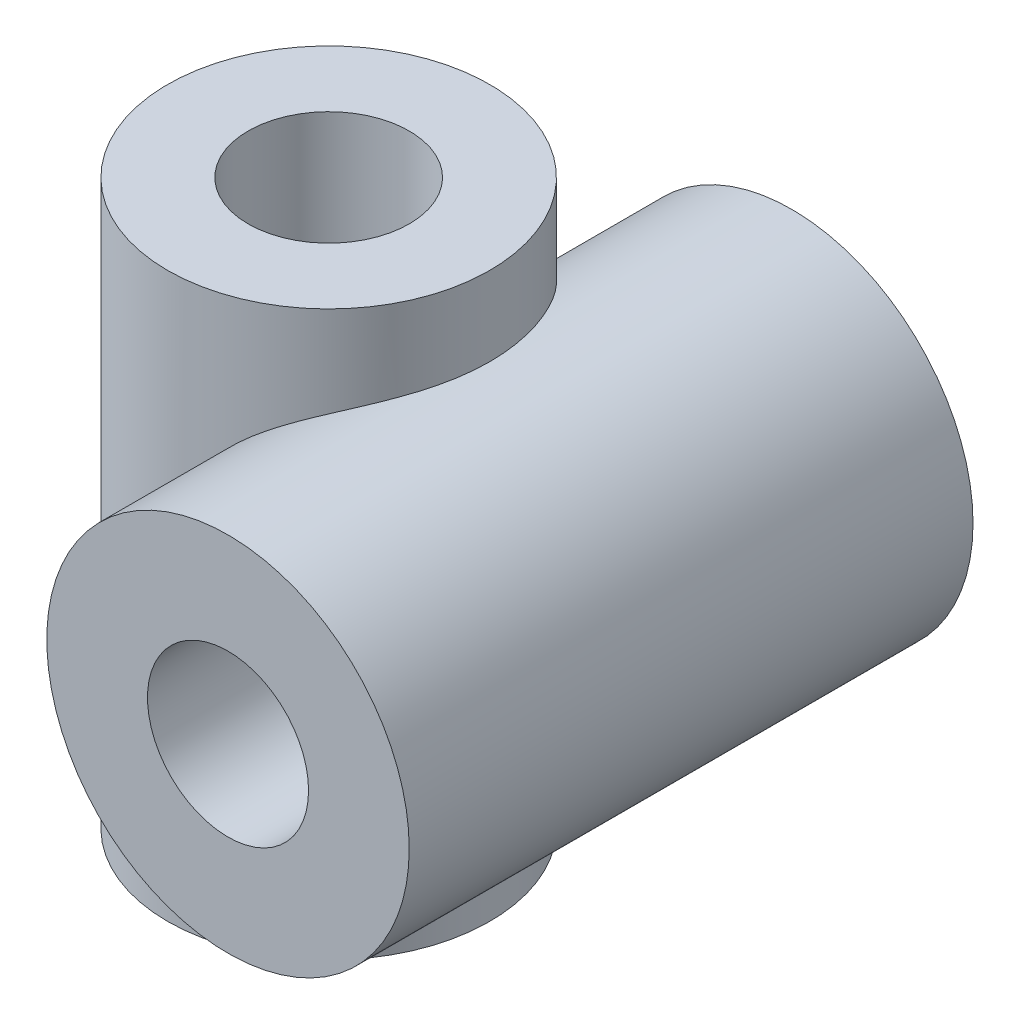
ISO-10303-21;
HEADER;
FILE_DESCRIPTION(('STEP AP214'),'2;1');
FILE_NAME('part.step','',(''),(''),'','','');
FILE_SCHEMA(('AUTOMOTIVE_DESIGN { 1 0 10303 214 1 1 1 1 }'));
ENDSEC;
DATA;
#1=APPLICATION_CONTEXT('core data for automotive mechanical design processes');
#2=APPLICATION_PROTOCOL_DEFINITION('international standard','automotive_design',2000,#1);
#3=PRODUCT_CONTEXT('',#1,'mechanical');
#4=PRODUCT('Part','Part','',(#3));
#5=PRODUCT_RELATED_PRODUCT_CATEGORY('part','',(#4));
#6=PRODUCT_DEFINITION_FORMATION('','',#4);
#7=PRODUCT_DEFINITION_CONTEXT('part definition',#1,'design');
#8=PRODUCT_DEFINITION('design','',#6,#7);
#9=PRODUCT_DEFINITION_SHAPE('','',#8);
#10=(LENGTH_UNIT() NAMED_UNIT(*) SI_UNIT(.MILLI.,.METRE.));
#11=(NAMED_UNIT(*) PLANE_ANGLE_UNIT() SI_UNIT($,.RADIAN.));
#12=(NAMED_UNIT(*) SI_UNIT($,.STERADIAN.) SOLID_ANGLE_UNIT());
#13=UNCERTAINTY_MEASURE_WITH_UNIT(LENGTH_MEASURE(1.E-05),#10,'distance_accuracy_value','');
#14=(GEOMETRIC_REPRESENTATION_CONTEXT(3) GLOBAL_UNCERTAINTY_ASSIGNED_CONTEXT((#13)) GLOBAL_UNIT_ASSIGNED_CONTEXT((#10,
#11,#12)) REPRESENTATION_CONTEXT('',''));
#15=CARTESIAN_POINT('',(0.,0.,0.));
#16=DIRECTION('',(0.,0.,1.));
#17=DIRECTION('',(1.,0.,0.));
#18=AXIS2_PLACEMENT_3D('',#15,#16,#17);
#19=CARTESIAN_POINT('',(0.,56.,0.));
#20=DIRECTION('',(0.,1.,0.));
#21=DIRECTION('',(0.,0.,1.));
#22=AXIS2_PLACEMENT_3D('',#19,#20,#21);
#23=PLANE('',#22);
#24=CARTESIAN_POINT('',(0.,56.,0.));
#25=DIRECTION('',(0.,1.,0.));
#26=DIRECTION('',(0.,0.,1.));
#27=AXIS2_PLACEMENT_3D('',#24,#25,#26);
#28=CIRCLE('',#27,16.);
#29=CARTESIAN_POINT('',(0.,56.,16.));
#30=VERTEX_POINT('',#29);
#31=EDGE_CURVE('E10',#30,#30,#28,.T.);
#32=ORIENTED_EDGE('',*,*,#31,.T.);
#33=EDGE_LOOP('',(#32));
#34=FACE_BOUND('',#33,.T.);
#35=CARTESIAN_POINT('',(0.,56.,0.));
#36=DIRECTION('',(0.,1.,0.));
#37=DIRECTION('',(0.,0.,1.));
#38=AXIS2_PLACEMENT_3D('',#35,#36,#37);
#39=CIRCLE('',#38,8.);
#40=CARTESIAN_POINT('',(0.,56.,8.));
#41=VERTEX_POINT('',#40);
#42=EDGE_CURVE('E42',#41,#41,#39,.T.);
#43=ORIENTED_EDGE('',*,*,#42,.F.);
#44=EDGE_LOOP('',(#43));
#45=FACE_BOUND('',#44,.T.);
#46=ADVANCED_FACE('F30',(#34,#45),#23,.T.);
#47=CARTESIAN_POINT('',(0.,0.,0.));
#48=DIRECTION('',(0.,1.,0.));
#49=DIRECTION('',(0.,0.,1.));
#50=AXIS2_PLACEMENT_3D('',#47,#48,#49);
#51=PLANE('',#50);
#52=CARTESIAN_POINT('',(0.,0.,0.));
#53=DIRECTION('',(0.,1.,0.));
#54=DIRECTION('',(0.,0.,1.));
#55=AXIS2_PLACEMENT_3D('',#52,#53,#54);
#56=CIRCLE('',#55,16.);
#57=CARTESIAN_POINT('',(0.,0.,16.));
#58=VERTEX_POINT('',#57);
#59=EDGE_CURVE('E35',#58,#58,#56,.T.);
#60=ORIENTED_EDGE('',*,*,#59,.F.);
#61=EDGE_LOOP('',(#60));
#62=FACE_BOUND('',#61,.T.);
#63=CARTESIAN_POINT('',(0.,0.,0.));
#64=DIRECTION('',(0.,1.,0.));
#65=DIRECTION('',(0.,0.,1.));
#66=AXIS2_PLACEMENT_3D('',#63,#64,#65);
#67=CIRCLE('',#66,8.);
#68=CARTESIAN_POINT('',(0.,0.,8.));
#69=VERTEX_POINT('',#68);
#70=EDGE_CURVE('E44',#69,#69,#67,.T.);
#71=ORIENTED_EDGE('',*,*,#70,.T.);
#72=EDGE_LOOP('',(#71));
#73=FACE_BOUND('',#72,.T.);
#74=ADVANCED_FACE('F71',(#62,#73),#51,.F.);
#75=CARTESIAN_POINT('',(0.,56.,0.));
#76=DIRECTION('',(0.,-1.,0.));
#77=DIRECTION('',(0.,0.,-1.));
#78=AXIS2_PLACEMENT_3D('',#75,#76,#77);
#79=CYLINDRICAL_SURFACE('',#78,16.);
#80=CARTESIAN_POINT('',(0.,30.2580987154858,-16.));
#81=CARTESIAN_POINT('',(-1.44152324591814E-06,29.7562515484255,-15.9999965673234));
#82=CARTESIAN_POINT('',(0.020997954456366,29.254434664185,-16.0000404197795));
#83=CARTESIAN_POINT('',(0.104858168319032,28.2541389400685,-15.999712083541));
#84=CARTESIAN_POINT('',(0.167731888759293,27.7556611768932,-15.9993397665898));
#85=CARTESIAN_POINT('',(0.335057530149813,26.7648676740702,-15.9967100327279));
#86=CARTESIAN_POINT('',(0.439579980493313,26.2725638558117,-15.9944494109408));
#87=CARTESIAN_POINT('',(0.689449308875155,25.2985007253001,-15.9856270878324));
#88=CARTESIAN_POINT('',(0.834792873203099,24.8167405605715,-15.9790657355713));
#89=CARTESIAN_POINT('',(1.16553795751159,23.866346663656,-15.9583523911744));
#90=CARTESIAN_POINT('',(1.35101128463263,23.3977381852658,-15.9441867238924));
#91=CARTESIAN_POINT('',(1.76040846150652,22.4780600407479,-15.9041894852734));
#92=CARTESIAN_POINT('',(1.98433554670677,22.0269918543564,-15.878356932002));
#93=CARTESIAN_POINT('',(2.46830006089749,21.1466625013159,-15.8103482528168));
#94=CARTESIAN_POINT('',(2.72829100800956,20.7173742205301,-15.7681930414733));
#95=CARTESIAN_POINT('',(3.28181914125159,19.8838412409315,-15.6623426856497));
#96=CARTESIAN_POINT('',(3.57534713216145,19.4795897241656,-15.5986534360552));
#97=CARTESIAN_POINT('',(4.12662372168982,18.7827852274012,-15.4607126249303));
#98=CARTESIAN_POINT('',(4.37873539456164,18.4847409483517,-15.3915753554479));
#99=CARTESIAN_POINT('',(4.89900371667317,17.9084224069316,-15.2339623050471));
#100=CARTESIAN_POINT('',(5.16715813301694,17.6301454050076,-15.1454892108425));
#101=CARTESIAN_POINT('',(5.71636577014552,17.0953050696229,-14.9468504713011));
#102=CARTESIAN_POINT('',(5.99740878873618,16.8387250039899,-14.8367017638856));
#103=CARTESIAN_POINT('',(6.56908064830899,16.3485393578552,-14.5925922005622));
#104=CARTESIAN_POINT('',(6.85970962838691,16.1149341109224,-14.4586309990025));
#105=CARTESIAN_POINT('',(7.44787096592969,15.6708100836549,-14.1646661467591));
#106=CARTESIAN_POINT('',(7.74542888852442,15.4604022015195,-14.0045457740037));
#107=CARTESIAN_POINT('',(8.34168997903154,15.0645104118087,-13.6577861333643));
#108=CARTESIAN_POINT('',(8.6403931477888,14.8790265226238,-13.4711468459129));
#109=CARTESIAN_POINT('',(9.2343301222545,14.5329213037377,-13.0711640560898));
#110=CARTESIAN_POINT('',(9.52956374505578,14.372301279422,-12.8578191527009));
#111=CARTESIAN_POINT('',(10.1119922877915,14.075199405426,-12.4049850585467));
#112=CARTESIAN_POINT('',(10.3991875174645,13.9387166245987,-12.1654968768921));
#113=CARTESIAN_POINT('',(10.940357460978,13.6978279059007,-11.6803539607644));
#114=CARTESIAN_POINT('',(11.1952134315061,13.5917901665646,-11.4364863939831));
#115=CARTESIAN_POINT('',(11.6914137442019,13.3977096463093,-10.9287164112978));
#116=CARTESIAN_POINT('',(11.9327588556621,13.3096658400786,-10.6648151381094));
#117=CARTESIAN_POINT('',(12.3994054825616,13.1497905403627,-10.1184901483326));
#118=CARTESIAN_POINT('',(12.6247036435075,13.0779624298769,-9.83606258252808));
#119=CARTESIAN_POINT('',(13.0570422777192,12.9486186974546,-9.254456699044));
#120=CARTESIAN_POINT('',(13.2640817348378,12.8911038717676,-8.95527745060001));
#121=CARTESIAN_POINT('',(13.6694229574258,12.7854781532542,-8.32438577902622));
#122=CARTESIAN_POINT('',(13.8665421088249,12.7380960144391,-7.99179161587386));
#123=CARTESIAN_POINT('',(14.2366850575584,12.654875784195,-7.31208445641836));
#124=CARTESIAN_POINT('',(14.4097082247327,12.6190379946427,-6.9649710807162));
#125=CARTESIAN_POINT('',(14.7303928504747,12.5567889409378,-6.25828530119365));
#126=CARTESIAN_POINT('',(14.8780465409628,12.5303805613912,-5.89870912164679));
#127=CARTESIAN_POINT('',(15.1469142458887,12.485128053706,-5.1693408308261));
#128=CARTESIAN_POINT('',(15.2681270088381,12.4662842835761,-4.79954823692713));
#129=CARTESIAN_POINT('',(15.4939803233831,12.4329985708163,-4.01488467289609));
#130=CARTESIAN_POINT('',(15.5957969418104,12.4191761502723,-3.59917200944044));
#131=CARTESIAN_POINT('',(15.7658209480876,12.3970855467927,-2.76077479311478));
#132=CARTESIAN_POINT('',(15.8340263386968,12.388817693909,-2.33808982747983));
#133=CARTESIAN_POINT('',(15.936360687541,12.3767101755624,-1.48846321772855));
#134=CARTESIAN_POINT('',(15.970482691515,12.3728714137717,-1.0615207228606));
#135=CARTESIAN_POINT('',(16.004393924952,12.3690561889046,-0.206258974848302));
#136=CARTESIAN_POINT('',(16.0041828236366,12.3690797630395,0.222060291520633));
#137=CARTESIAN_POINT('',(15.9687157691683,12.3730704207107,1.0947768502642));
#138=CARTESIAN_POINT('',(15.9320281619012,12.3771986050002,1.53911595487172));
#139=CARTESIAN_POINT('',(15.8217214660681,12.390301538091,2.42312893469331));
#140=CARTESIAN_POINT('',(15.7481010259221,12.3992764642628,2.86280263857277));
#141=CARTESIAN_POINT('',(15.5644568619264,12.4233937309249,3.73444819317107));
#142=CARTESIAN_POINT('',(15.454422732236,12.4385378346503,4.16641780508188));
#143=CARTESIAN_POINT('',(15.1988254579215,12.4769258245701,5.01935246163553));
#144=CARTESIAN_POINT('',(15.053262741562,12.5001696131318,5.44031763885907));
#145=CARTESIAN_POINT('',(14.7282931273698,12.5571649920848,6.26689943601584));
#146=CARTESIAN_POINT('',(14.5489816568662,12.5908871249904,6.6725555524397));
#147=CARTESIAN_POINT('',(14.1579104520205,12.6717916547552,7.4665514012632));
#148=CARTESIAN_POINT('',(13.9461503261948,12.7189742140165,7.85489092467019));
#149=CARTESIAN_POINT('',(13.4925234674714,12.8300429812796,8.61080616114831));
#150=CARTESIAN_POINT('',(13.2506729272645,12.8939202254913,8.97839288850596));
#151=CARTESIAN_POINT('',(12.7396872896685,13.0418331445281,9.68979330633569));
#152=CARTESIAN_POINT('',(12.4705545716381,13.1258670623024,10.033609065552));
#153=CARTESIAN_POINT('',(11.925875900456,13.311634575746,10.674236718527));
#154=CARTESIAN_POINT('',(11.6517230970836,13.4119754450653,10.9726365739665));
#155=CARTESIAN_POINT('',(11.086432647116,13.6359760360981,11.5434970496574));
#156=CARTESIAN_POINT('',(10.7952958027109,13.7596346570823,11.8159588934157));
#157=CARTESIAN_POINT('',(10.2007433320852,14.0322421775198,12.332878361086));
#158=CARTESIAN_POINT('',(9.89733834964196,14.1811694979468,12.5773595841129));
#159=CARTESIAN_POINT('',(9.28301284383141,14.5058052897319,13.0373652457959));
#160=CARTESIAN_POINT('',(8.97209297792912,14.6815114253395,13.2528922068716));
#161=CARTESIAN_POINT('',(8.37984942598162,15.0409963700389,13.6341214973513));
#162=CARTESIAN_POINT('',(8.09873851552046,15.2221279074184,13.8026630360098));
#163=CARTESIAN_POINT('',(7.53855702707224,15.6063571295761,14.1164162489521));
#164=CARTESIAN_POINT('',(7.25948629202506,15.8094531040299,14.2616297375565));
#165=CARTESIAN_POINT('',(6.70697785374948,16.2370534651061,14.5296515691391));
#166=CARTESIAN_POINT('',(6.43354126417159,16.461562035724,14.652455519607));
#167=CARTESIAN_POINT('',(5.89567936802593,16.9309519410662,14.8770266738676));
#168=CARTESIAN_POINT('',(5.63125442625719,17.1758340991526,14.9787930268834));
#169=CARTESIAN_POINT('',(5.11247546711442,17.6864975934802,15.16373958454));
#170=CARTESIAN_POINT('',(4.85820800824197,17.9524171344409,15.2467802022054));
#171=CARTESIAN_POINT('',(4.36430075728341,18.5020687367222,15.3954346667601));
#172=CARTESIAN_POINT('',(4.12466088557454,18.785800701067,15.461048608515));
#173=CARTESIAN_POINT('',(3.66198650843725,19.3695663617932,15.5771234120359));
#174=CARTESIAN_POINT('',(3.43895745685159,19.6696053568322,15.627579313303));
#175=CARTESIAN_POINT('',(3.01123279222213,20.2842783986554,15.7156024931584));
#176=CARTESIAN_POINT('',(2.80653841695005,20.5989134286428,15.7531689020626));
#177=CARTESIAN_POINT('',(2.38927576759966,21.2865314466934,15.8222060029687));
#178=CARTESIAN_POINT('',(2.17967648999509,21.6614803270819,15.852067099021));
#179=CARTESIAN_POINT('',(1.78758891193525,22.4259644373805,15.9010556645654));
#180=CARTESIAN_POINT('',(1.6051026295183,22.8155007503439,15.9201823353812));
#181=CARTESIAN_POINT('',(1.26832228478263,23.6070802842432,15.9505476432288));
#182=CARTESIAN_POINT('',(1.11404147367215,24.0091292804917,15.9617825796548));
#183=CARTESIAN_POINT('',(0.834662090852644,24.8233525143204,15.9788272206767));
#184=CARTESIAN_POINT('',(0.709564896298699,25.2355272287123,15.9846366692864));
#185=CARTESIAN_POINT('',(0.474346044499364,26.1240707655817,15.9934588574717));
#186=CARTESIAN_POINT('',(0.368530024719413,26.6015900004962,15.9959878021015));
#187=CARTESIAN_POINT('',(0.196095757717886,27.563681980772,15.9990305247379));
#188=CARTESIAN_POINT('',(0.129480685113585,28.0482552941394,15.9995441395557));
#189=CARTESIAN_POINT('',(0.0358923128807841,29.0212759755835,16.0000285415631));
#190=CARTESIAN_POINT('',(0.00892353522726493,29.5097237791896,15.9999992668368));
#191=CARTESIAN_POINT('',(-0.00517809638011661,30.4871880187729,16.0000005140018));
#192=CARTESIAN_POINT('',(0.00768899057575417,30.9762044539054,16.0000310358043));
#193=CARTESIAN_POINT('',(0.0743034766442019,31.9683703568688,15.9998639620668));
#194=CARTESIAN_POINT('',(0.129442674291354,32.4714269562921,15.9996584788997));
#195=CARTESIAN_POINT('',(0.281870370277135,33.4711284419878,15.9976979991602));
#196=CARTESIAN_POINT('',(0.379160594459055,33.9677730648691,15.9959429391384));
#197=CARTESIAN_POINT('',(0.615271388967311,34.9514124022145,15.9886018445671));
#198=CARTESIAN_POINT('',(0.754119006714477,35.4384006110786,15.9830133119516));
#199=CARTESIAN_POINT('',(1.07229521746466,36.3988407303825,15.9648224690253));
#200=CARTESIAN_POINT('',(1.25162306157284,36.8722928910602,15.9522202884624));
#201=CARTESIAN_POINT('',(1.64895686223284,37.8011779947017,15.916049767064));
#202=CARTESIAN_POINT('',(1.86688643110166,38.2566443912338,15.8925029374554));
#203=CARTESIAN_POINT('',(2.3397639476328,39.1469128053569,15.8297935208302));
#204=CARTESIAN_POINT('',(2.5947144963897,39.5817133681147,15.7906298362352));
#205=CARTESIAN_POINT('',(3.13857904441596,40.4261869306502,15.691576970202));
#206=CARTESIAN_POINT('',(3.42744270432119,40.8358958336801,15.6317182571217));
#207=CARTESIAN_POINT('',(4.03578929972986,41.626892961378,15.4858036274933));
#208=CARTESIAN_POINT('',(4.35526204221462,42.0081905725131,15.3997564112503));
#209=CARTESIAN_POINT('',(4.94093874394202,42.6517586767479,15.2202937390119));
#210=CARTESIAN_POINT('',(5.20177173518269,42.920789252839,15.1334828422832));
#211=CARTESIAN_POINT('',(5.73565407548553,43.4385383104154,14.93930746143));
#212=CARTESIAN_POINT('',(6.00870147962621,43.6872600080233,14.8319462407041));
#213=CARTESIAN_POINT('',(6.56360521229226,44.1628574915352,14.5948630414646));
#214=CARTESIAN_POINT('',(6.84545490887262,44.3897492228563,14.4651575802589));
#215=CARTESIAN_POINT('',(7.41449336351184,44.8208753828061,14.1818994288528));
#216=CARTESIAN_POINT('',(7.70168224559009,45.0251092843655,14.0283461841017));
#217=CARTESIAN_POINT('',(8.27822565695393,45.4109129037624,13.696057222048));
#218=CARTESIAN_POINT('',(8.56758406061968,45.5924147311794,13.5172493121046));
#219=CARTESIAN_POINT('',(9.14343253943528,45.9320571794614,13.134577848504));
#220=CARTESIAN_POINT('',(9.42992261011621,46.0901977639343,12.9307142558162));
#221=CARTESIAN_POINT('',(9.99595880712482,46.3837623113196,12.4983071797624));
#222=CARTESIAN_POINT('',(10.2755030407345,46.5191801389554,12.2697570581825));
#223=CARTESIAN_POINT('',(10.8236634680044,46.768424971301,11.7890287099794));
#224=CARTESIAN_POINT('',(11.0922797715844,46.8822521932244,11.536850721104));
#225=CARTESIAN_POINT('',(11.6037297114191,47.0854621253499,11.0217709060492));
#226=CARTESIAN_POINT('',(11.8471763403282,47.1756912078949,10.7598092202041));
#227=CARTESIAN_POINT('',(12.3182130376993,47.3396531451822,10.2171771269382));
#228=CARTESIAN_POINT('',(12.5458036655444,47.4133865820768,9.93650738020238));
#229=CARTESIAN_POINT('',(12.982953696595,47.5462874102126,9.35811745564804));
#230=CARTESIAN_POINT('',(13.1925092303507,47.6054516806654,9.06039364156847));
#231=CARTESIAN_POINT('',(13.5917165135469,47.7111696681915,8.44975345384106));
#232=CARTESIAN_POINT('',(13.7813671085989,47.7577226541196,8.13683620058599));
#233=CARTESIAN_POINT('',(14.1535276011765,47.8434330070099,7.4722158093416));
#234=CARTESIAN_POINT('',(14.3342686878584,47.8817072094295,7.11940764108801));
#235=CARTESIAN_POINT('',(14.6693602064472,47.9480965420155,6.40055948031795));
#236=CARTESIAN_POINT('',(14.8237095585264,47.9762112565552,6.03451894713629));
#237=CARTESIAN_POINT('',(15.1049343323321,48.0243296938466,5.29139271012836));
#238=CARTESIAN_POINT('',(15.2318013323686,48.044330931939,4.91430366067021));
#239=CARTESIAN_POINT('',(15.4571532447266,48.0779445829191,4.15145979128578));
#240=CARTESIAN_POINT('',(15.5556370402227,48.091556744422,3.76570463100812));
#241=CARTESIAN_POINT('',(15.7311715316643,48.1147778709893,2.95269489378799));
#242=CARTESIAN_POINT('',(15.8054893666554,48.1239152742606,2.5248343907591));
#243=CARTESIAN_POINT('',(15.9191112401622,48.1375050547814,1.66440376679603));
#244=CARTESIAN_POINT('',(15.9584132763279,48.1419571641089,1.23183337796241));
#245=CARTESIAN_POINT('',(16.0017291360712,48.1468492110555,0.364818426179327));
#246=CARTESIAN_POINT('',(16.0057359632633,48.1472883532057,-0.0696264912732996));
#247=CARTESIAN_POINT('',(15.9784151307426,48.1442212016999,-0.937388302985251));
#248=CARTESIAN_POINT('',(15.9470873375861,48.1407148931437,-1.37070519297831));
#249=CARTESIAN_POINT('',(15.847925105678,48.1290569358945,-2.24555457441686));
#250=CARTESIAN_POINT('',(15.7790797880701,48.1207762698031,-2.68697119590934));
#251=CARTESIAN_POINT('',(15.6047644417812,48.0982376594216,-3.56237447836962));
#252=CARTESIAN_POINT('',(15.4992932990811,48.0839795333169,-3.9963609129179));
#253=CARTESIAN_POINT('',(15.2525251378176,48.0476161163934,-4.85381777702667));
#254=CARTESIAN_POINT('',(15.1112192764334,48.0255088881368,-5.27728558257764));
#255=CARTESIAN_POINT('',(14.7939839247896,47.9710134002382,-6.11037534908108));
#256=CARTESIAN_POINT('',(14.618055130081,47.9386253471229,-6.51999758798786));
#257=CARTESIAN_POINT('',(14.2353643121073,47.8610865312545,-7.31763992097718));
#258=CARTESIAN_POINT('',(14.028971236759,47.8160833736848,-7.70585112804725));
#259=CARTESIAN_POINT('',(13.5860187966365,47.7099927755288,-8.4623994098219));
#260=CARTESIAN_POINT('',(13.3494593073117,47.6489052685326,-8.8307364024611));
#261=CARTESIAN_POINT('',(12.8491340648177,47.5073329853942,-9.54407531033515));
#262=CARTESIAN_POINT('',(12.5853907390479,47.4268641272598,-9.88909607905335));
#263=CARTESIAN_POINT('',(12.0340761669766,47.2431539766024,-10.5530625466621));
#264=CARTESIAN_POINT('',(11.7465075139787,47.1399151604818,-10.8720110759366));
#265=CARTESIAN_POINT('',(11.1750754786287,46.9166404883083,-11.4573892970001));
#266=CARTESIAN_POINT('',(10.8926642257003,46.7985361637971,-11.7259743953021));
#267=CARTESIAN_POINT('',(10.3153886437321,46.5383605301116,-12.2368821433741));
#268=CARTESIAN_POINT('',(10.0205250675811,46.3962906683843,-12.4792063777709));
#269=CARTESIAN_POINT('',(9.42309125213223,46.0868609418376,-12.9362571126499));
#270=CARTESIAN_POINT('',(9.12052549009078,45.9195155025825,-13.1509992265758));
#271=CARTESIAN_POINT('',(8.51241708661594,45.5587749073632,-13.5525461579513));
#272=CARTESIAN_POINT('',(8.20687461179384,45.3653812016787,-13.7393525295479));
#273=CARTESIAN_POINT('',(7.62546863439118,44.9713918518224,-14.0696012028098));
#274=CARTESIAN_POINT('',(7.34943288119526,44.7730503594376,-14.2154420899983));
#275=CARTESIAN_POINT('',(6.80253389615858,44.3554424059926,-14.4851125446758));
#276=CARTESIAN_POINT('',(6.53167029868209,44.1361774306999,-14.6089436732832));
#277=CARTESIAN_POINT('',(5.99830911761082,43.6776047617393,-14.8359135320326));
#278=CARTESIAN_POINT('',(5.73581313408452,43.4382932661083,-14.9390483243177));
#279=CARTESIAN_POINT('',(5.22209269361479,42.9408800081048,-15.1262855318161));
#280=CARTESIAN_POINT('',(4.97086883426855,42.6827772514024,-15.2103869389188));
#281=CARTESIAN_POINT('',(4.4718431959744,42.137960651957,-15.3646896263414));
#282=CARTESIAN_POINT('',(4.22463101970431,41.8504996732637,-15.4341564259778));
#283=CARTESIAN_POINT('',(3.74737084294317,41.2584249152205,-15.556925941519));
#284=CARTESIAN_POINT('',(3.5173231919487,40.9538107868271,-15.6102283283587));
#285=CARTESIAN_POINT('',(3.07606414433344,40.3289735498634,-15.703143313443));
#286=CARTESIAN_POINT('',(2.86486465557465,40.0087407685687,-15.742747302134));
#287=CARTESIAN_POINT('',(2.46287890140913,39.3545435647021,-15.8106225433824));
#288=CARTESIAN_POINT('',(2.27209485143439,39.0205776572784,-15.8388925669188));
#289=CARTESIAN_POINT('',(1.88425519169324,38.288043087228,-15.8900461544996));
#290=CARTESIAN_POINT('',(1.69078605713282,37.8874661510859,-15.9114223312645));
#291=CARTESIAN_POINT('',(1.33391179477249,37.0727420892197,-15.9453069878298));
#292=CARTESIAN_POINT('',(1.17051108801214,36.6585929784727,-15.9578141643682));
#293=CARTESIAN_POINT('',(0.874913642355339,35.8194947037438,-15.9767476402787));
#294=CARTESIAN_POINT('',(0.742695234325663,35.3945532683575,-15.9831781718186));
#295=CARTESIAN_POINT('',(0.510112403267851,34.5361342133545,-15.9922885650762));
#296=CARTESIAN_POINT('',(0.409741018017281,34.1026584814967,-15.994969247003));
#297=CARTESIAN_POINT('',(0.217375972957765,33.1049618653107,-15.9988956665513));
#298=CARTESIAN_POINT('',(0.135916176036432,32.5386762327388,-15.9995149982554));
#299=CARTESIAN_POINT('',(0.0272290981446276,31.4009468744111,-16.000069118097));
#300=CARTESIAN_POINT('',(1.64132200282864E-06,30.8295031653869,-16.0000039084542));
#301=CARTESIAN_POINT('',(0.,30.2580987154858,-16.));
#302=B_SPLINE_CURVE_WITH_KNOTS('',3,(#80,#81,#82,#83,#84,#85,#86,#87,#88,#89,#90,#91,#92,#93,
#94,#95,#96,#97,#98,#99,#100,#101,#102,#103,#104,#105,#106,#107,#108,#109,#110,#111,#112,#113,
#114,#115,#116,#117,#118,#119,#120,#121,#122,#123,#124,#125,#126,#127,#128,#129,#130,#131,#132,
#133,#134,#135,#136,#137,#138,#139,#140,#141,#142,#143,#144,#145,#146,#147,#148,#149,#150,#151,
#152,#153,#154,#155,#156,#157,#158,#159,#160,#161,#162,#163,#164,#165,#166,#167,#168,#169,#170,
#171,#172,#173,#174,#175,#176,#177,#178,#179,#180,#181,#182,#183,#184,#185,#186,#187,#188,#189,
#190,#191,#192,#193,#194,#195,#196,#197,#198,#199,#200,#201,#202,#203,#204,#205,#206,#207,#208,
#209,#210,#211,#212,#213,#214,#215,#216,#217,#218,#219,#220,#221,#222,#223,#224,#225,#226,#227,
#228,#229,#230,#231,#232,#233,#234,#235,#236,#237,#238,#239,#240,#241,#242,#243,#244,#245,#246,
#247,#248,#249,#250,#251,#252,#253,#254,#255,#256,#257,#258,#259,#260,#261,#262,#263,#264,#265,
#266,#267,#268,#269,#270,#271,#272,#273,#274,#275,#276,#277,#278,#279,#280,#281,#282,#283,#284,
#285,#286,#287,#288,#289,#290,#291,#292,#293,#294,#295,#296,#297,#298,#299,#300,#301),
.UNSPECIFIED.,.T.,.F.,(4,2,2,2,2,2,2,2,2,2,2,2,2,2,2,2,2,2,2,2,2,2,2,2,2,2,2,2,2,2,2,2,2,2,2,2,
2,2,2,2,2,2,2,2,2,2,2,2,2,2,2,2,2,2,2,2,2,2,2,2,2,2,2,2,2,2,2,2,2,2,2,2,2,2,2,2,2,2,2,2,2,2,2,2,
2,2,2,2,2,2,2,2,2,2,2,2,2,2,2,2,2,2,2,2,2,2,2,2,2,2,4),(0.,1.50505069617252,3.01056535188682,
4.51864040734472,6.02659307808915,7.53726669037527,9.04806747103663,10.5569388023883,
12.0653974182039,13.2535558558109,14.4415493035774,15.6286180807415,16.8157040902891,
18.0082392809472,19.2007753515325,20.3933740106059,21.5859266525375,22.6896757281891,
23.7933618936171,24.8972781032234,26.0012557100933,27.1685651226847,28.3359050571143,
29.5036017940014,30.6713537877204,31.9545772717363,33.2378769980423,34.5214385111065,
35.8050123905017,37.1410358070206,38.477108119717,39.8135625683259,41.1500009079932,
42.4827156369207,43.8154464459291,45.1474631435728,46.4793637719202,47.7300015092244,
48.980580224154,50.2300962931047,51.4795034368,52.6015902327979,53.7235897170905,
54.8458088896594,55.968073436766,57.0984457737097,58.2288119571171,59.3595476531664,
60.4903596275984,61.7808356659674,63.0714077072624,64.3625845225592,65.6538222552957,
67.1194841566879,68.5852647357099,70.0512124856869,71.5171580611609,73.0335593682975,
74.5500227692572,76.0674753070117,77.5848997737957,79.0993543396333,80.6139153626016,
82.1262559947275,83.6380947467422,84.7908404087248,85.9434031659377,87.0951175533764,
88.2468587265138,89.4019615173967,90.5570661076747,91.712482082797,92.8678864331672,
93.9731556795915,95.0783859135063,96.1838526877319,97.2893835382135,98.4828777646707,
99.67642081171,100.870329092213,102.064284344326,103.365883406246,104.667556894272,
105.969488400448,107.271424823475,108.610312167485,109.94924023895,111.288499035533,
112.627730930069,113.951903852502,115.276082242342,116.599176763802,117.922127459773,
119.14215928278,120.362117445875,121.581381953398,122.800578604422,123.908906535822,
125.017155823822,126.125615777024,127.234134426505,128.389333501469,129.544556091677,
130.700503434843,131.856576091563,133.191291996474,134.526203991622,135.860185581157,
137.193875341659,138.907535416213,140.621189934096),.UNSPECIFIED.);
#303=CARTESIAN_POINT('',(0.,30.2580987154858,-16.));
#304=VERTEX_POINT('',#303);
#305=EDGE_CURVE('E47',#304,#304,#302,.T.);
#306=ORIENTED_EDGE('',*,*,#305,.T.);
#307=EDGE_LOOP('',(#306));
#308=FACE_BOUND('',#307,.T.);
#309=ORIENTED_EDGE('',*,*,#31,.F.);
#310=EDGE_LOOP('',(#309));
#311=FACE_BOUND('',#310,.T.);
#312=ORIENTED_EDGE('',*,*,#59,.T.);
#313=EDGE_LOOP('',(#312));
#314=FACE_BOUND('',#313,.T.);
#315=ADVANCED_FACE('F32',(#308,#311,#314),#79,.T.);
#316=CARTESIAN_POINT('',(0.,56.,0.));
#317=DIRECTION('',(0.,-1.,0.));
#318=DIRECTION('',(0.,0.,-1.));
#319=AXIS2_PLACEMENT_3D('',#316,#317,#318);
#320=CYLINDRICAL_SURFACE('',#319,8.);
#321=ORIENTED_EDGE('',*,*,#42,.T.);
#322=EDGE_LOOP('',(#321));
#323=FACE_BOUND('',#322,.T.);
#324=ORIENTED_EDGE('',*,*,#70,.F.);
#325=EDGE_LOOP('',(#324));
#326=FACE_BOUND('',#325,.T.);
#327=ADVANCED_FACE('F66',(#323,#326),#320,.F.);
#328=CARTESIAN_POINT('',(18.,30.2580987154858,-28.));
#329=DIRECTION('',(0.,0.,1.));
#330=DIRECTION('',(1.,0.,0.));
#331=AXIS2_PLACEMENT_3D('',#328,#329,#330);
#332=CYLINDRICAL_SURFACE('',#331,8.);
#333=CARTESIAN_POINT('',(18.,30.2580987154858,28.));
#334=DIRECTION('',(0.,0.,1.));
#335=DIRECTION('',(1.,0.,0.));
#336=AXIS2_PLACEMENT_3D('',#333,#334,#335);
#337=CIRCLE('',#336,8.);
#338=CARTESIAN_POINT('',(26.,30.2580987154858,28.));
#339=VERTEX_POINT('',#338);
#340=EDGE_CURVE('E152',#339,#339,#337,.T.);
#341=ORIENTED_EDGE('',*,*,#340,.T.);
#342=EDGE_LOOP('',(#341));
#343=FACE_BOUND('',#342,.T.);
#344=CARTESIAN_POINT('',(18.,30.2580987154858,-28.));
#345=DIRECTION('',(0.,0.,1.));
#346=DIRECTION('',(1.,0.,0.));
#347=AXIS2_PLACEMENT_3D('',#344,#345,#346);
#348=CIRCLE('',#347,8.);
#349=CARTESIAN_POINT('',(26.,30.2580987154858,-28.));
#350=VERTEX_POINT('',#349);
#351=EDGE_CURVE('E154',#350,#350,#348,.T.);
#352=ORIENTED_EDGE('',*,*,#351,.F.);
#353=EDGE_LOOP('',(#352));
#354=FACE_BOUND('',#353,.T.);
#355=ADVANCED_FACE('F63',(#343,#354),#332,.F.);
#356=CARTESIAN_POINT('',(18.,30.2580987154858,-28.));
#357=DIRECTION('',(0.,0.,1.));
#358=DIRECTION('',(1.,0.,0.));
#359=AXIS2_PLACEMENT_3D('',#356,#357,#358);
#360=CYLINDRICAL_SURFACE('',#359,18.);
#361=CARTESIAN_POINT('',(18.,30.2580987154858,-28.));
#362=DIRECTION('',(0.,0.,1.));
#363=DIRECTION('',(1.,0.,0.));
#364=AXIS2_PLACEMENT_3D('',#361,#362,#363);
#365=CIRCLE('',#364,18.);
#366=CARTESIAN_POINT('',(36.,30.2580987154858,-28.));
#367=VERTEX_POINT('',#366);
#368=EDGE_CURVE('E55',#367,#367,#365,.T.);
#369=ORIENTED_EDGE('',*,*,#368,.T.);
#370=EDGE_LOOP('',(#369));
#371=FACE_BOUND('',#370,.T.);
#372=CARTESIAN_POINT('',(18.,30.2580987154858,28.));
#373=DIRECTION('',(0.,0.,1.));
#374=DIRECTION('',(1.,0.,0.));
#375=AXIS2_PLACEMENT_3D('',#372,#373,#374);
#376=CIRCLE('',#375,18.);
#377=CARTESIAN_POINT('',(36.,30.2580987154858,28.));
#378=VERTEX_POINT('',#377);
#379=EDGE_CURVE('E149',#378,#378,#376,.T.);
#380=ORIENTED_EDGE('',*,*,#379,.F.);
#381=EDGE_LOOP('',(#380));
#382=FACE_BOUND('',#381,.T.);
#383=ORIENTED_EDGE('',*,*,#305,.F.);
#384=EDGE_LOOP('',(#383));
#385=FACE_BOUND('',#384,.T.);
#386=ADVANCED_FACE('F57',(#371,#382,#385),#360,.T.);
#387=CARTESIAN_POINT('',(18.,30.2580987154858,-28.));
#388=DIRECTION('',(0.,0.,1.));
#389=DIRECTION('',(1.,0.,0.));
#390=AXIS2_PLACEMENT_3D('',#387,#388,#389);
#391=PLANE('',#390);
#392=ORIENTED_EDGE('',*,*,#351,.T.);
#393=EDGE_LOOP('',(#392));
#394=FACE_BOUND('',#393,.T.);
#395=ORIENTED_EDGE('',*,*,#368,.F.);
#396=EDGE_LOOP('',(#395));
#397=FACE_BOUND('',#396,.T.);
#398=ADVANCED_FACE('F62',(#394,#397),#391,.F.);
#399=CARTESIAN_POINT('',(18.,30.2580987154858,28.));
#400=DIRECTION('',(0.,0.,1.));
#401=DIRECTION('',(1.,0.,0.));
#402=AXIS2_PLACEMENT_3D('',#399,#400,#401);
#403=PLANE('',#402);
#404=ORIENTED_EDGE('',*,*,#379,.T.);
#405=EDGE_LOOP('',(#404));
#406=FACE_BOUND('',#405,.T.);
#407=ORIENTED_EDGE('',*,*,#340,.F.);
#408=EDGE_LOOP('',(#407));
#409=FACE_BOUND('',#408,.T.);
#410=ADVANCED_FACE('F109',(#406,#409),#403,.T.);
#411=CLOSED_SHELL('',(#46,#74,#315,#327,#355,#386,#398,#410));
#412=MANIFOLD_SOLID_BREP('B2',#411);
#413=ADVANCED_BREP_SHAPE_REPRESENTATION('',(#18,#412),#14);
#414=SHAPE_DEFINITION_REPRESENTATION(#9,#413);
ENDSEC;
END-ISO-10303-21;
